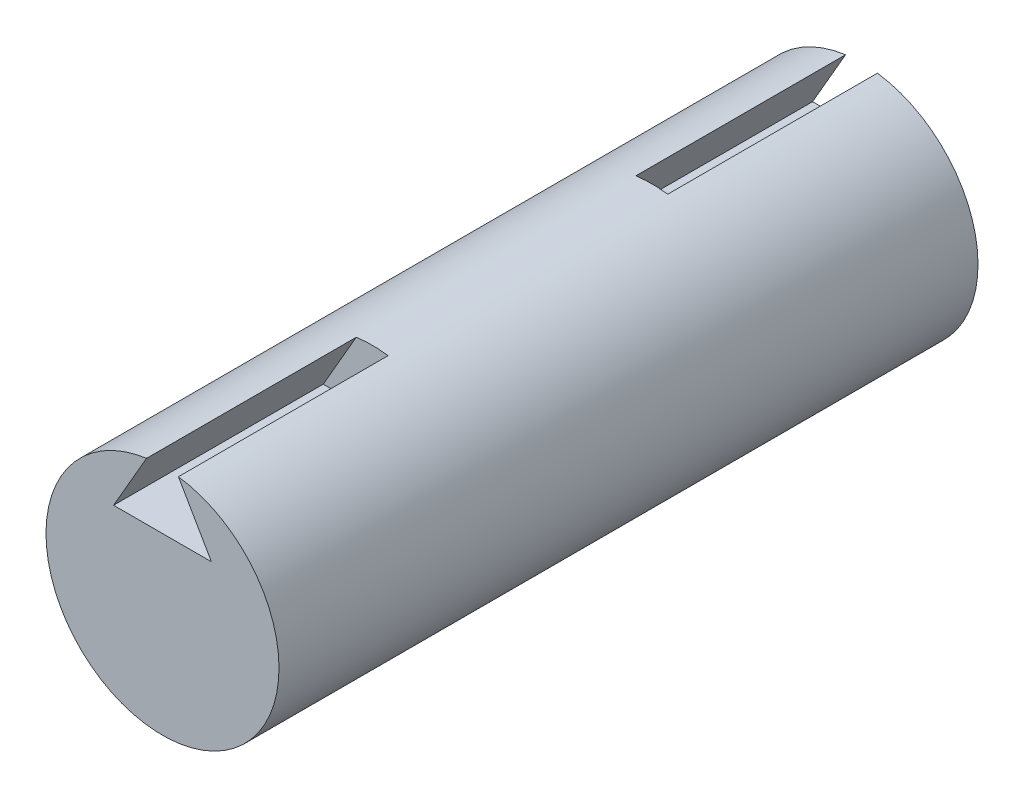
ISO-10303-21;
HEADER;
FILE_DESCRIPTION(('STEP AP214'),'2;1');
FILE_NAME('part.step','',(''),(''),'','','');
FILE_SCHEMA(('AUTOMOTIVE_DESIGN { 1 0 10303 214 1 1 1 1 }'));
ENDSEC;
DATA;
#1=APPLICATION_CONTEXT('core data for automotive mechanical design processes');
#2=APPLICATION_PROTOCOL_DEFINITION('international standard','automotive_design',2000,#1);
#3=PRODUCT_CONTEXT('',#1,'mechanical');
#4=PRODUCT('Part','Part','',(#3));
#5=PRODUCT_RELATED_PRODUCT_CATEGORY('part','',(#4));
#6=PRODUCT_DEFINITION_FORMATION('','',#4);
#7=PRODUCT_DEFINITION_CONTEXT('part definition',#1,'design');
#8=PRODUCT_DEFINITION('design','',#6,#7);
#9=PRODUCT_DEFINITION_SHAPE('','',#8);
#10=(LENGTH_UNIT() NAMED_UNIT(*) SI_UNIT(.MILLI.,.METRE.));
#11=(NAMED_UNIT(*) PLANE_ANGLE_UNIT() SI_UNIT($,.RADIAN.));
#12=(NAMED_UNIT(*) SI_UNIT($,.STERADIAN.) SOLID_ANGLE_UNIT());
#13=UNCERTAINTY_MEASURE_WITH_UNIT(LENGTH_MEASURE(1.E-05),#10,'distance_accuracy_value','');
#14=(GEOMETRIC_REPRESENTATION_CONTEXT(3) GLOBAL_UNCERTAINTY_ASSIGNED_CONTEXT((#13)) GLOBAL_UNIT_ASSIGNED_CONTEXT((#10,
#11,#12)) REPRESENTATION_CONTEXT('',''));
#15=CARTESIAN_POINT('',(0.,0.,0.));
#16=DIRECTION('',(0.,0.,1.));
#17=DIRECTION('',(1.,0.,0.));
#18=AXIS2_PLACEMENT_3D('',#15,#16,#17);
#19=CARTESIAN_POINT('',(0.265753175473055,0.153432667397367,3.));
#20=DIRECTION('',(-0.866025403784438,-0.500000000000001,0.));
#21=DIRECTION('',(0.500000000000001,-0.866025403784438,0.));
#22=AXIS2_PLACEMENT_3D('',#19,#20,#21);
#23=PLANE('',#22);
#24=DIRECTION('',(0.,0.,-1.));
#25=VECTOR('',#24,1.);
#26=CARTESIAN_POINT('',(0.21,0.25,3.));
#27=LINE('',#26,#25);
#28=CARTESIAN_POINT('',(0.21,0.25,0.9));
#29=VERTEX_POINT('',#28);
#30=CARTESIAN_POINT('',(0.21,0.25,0.));
#31=VERTEX_POINT('',#30);
#32=EDGE_CURVE('E122',#29,#31,#27,.T.);
#33=ORIENTED_EDGE('',*,*,#32,.F.);
#34=DIRECTION('',(-0.500000000000001,0.866025403784438,0.));
#35=VECTOR('',#34,1.);
#36=CARTESIAN_POINT('',(0.265753175473055,0.153432667397367,0.9));
#37=LINE('',#36,#35);
#38=CARTESIAN_POINT('',(0.0683743098989274,0.495302890912062,0.9));
#39=VERTEX_POINT('',#38);
#40=EDGE_CURVE('E114',#29,#39,#37,.T.);
#41=ORIENTED_EDGE('',*,*,#40,.T.);
#42=DIRECTION('',(0.,0.,-1.));
#43=VECTOR('',#42,1.);
#44=CARTESIAN_POINT('',(0.0683743098989273,0.495302890912062,3.));
#45=LINE('',#44,#43);
#46=CARTESIAN_POINT('',(0.0683743098989273,0.495302890912062,0.));
#47=VERTEX_POINT('',#46);
#48=EDGE_CURVE('E121',#39,#47,#45,.T.);
#49=ORIENTED_EDGE('',*,*,#48,.T.);
#50=DIRECTION('',(-0.500000000000001,0.866025403784438,0.));
#51=VECTOR('',#50,1.);
#52=CARTESIAN_POINT('',(0.265753175473055,0.153432667397367,0.));
#53=LINE('',#52,#51);
#54=EDGE_CURVE('E152',#31,#47,#53,.T.);
#55=ORIENTED_EDGE('',*,*,#54,.F.);
#56=EDGE_LOOP('',(#33,#41,#49,#55));
#57=FACE_BOUND('',#56,.T.);
#58=ADVANCED_FACE('F37',(#57),#23,.T.);
#59=CARTESIAN_POINT('',(0.,0.25,3.));
#60=DIRECTION('',(0.,1.,0.));
#61=DIRECTION('',(-1.,0.,0.));
#62=AXIS2_PLACEMENT_3D('',#59,#60,#61);
#63=PLANE('',#62);
#64=DIRECTION('',(0.,0.,-1.));
#65=VECTOR('',#64,1.);
#66=CARTESIAN_POINT('',(-0.21,0.25,3.));
#67=LINE('',#66,#65);
#68=CARTESIAN_POINT('',(-0.21,0.25,0.9));
#69=VERTEX_POINT('',#68);
#70=CARTESIAN_POINT('',(-0.21,0.25,0.));
#71=VERTEX_POINT('',#70);
#72=EDGE_CURVE('E138',#69,#71,#67,.T.);
#73=ORIENTED_EDGE('',*,*,#72,.F.);
#74=DIRECTION('',(1.,0.,0.));
#75=VECTOR('',#74,1.);
#76=CARTESIAN_POINT('',(0.,0.25,0.9));
#77=LINE('',#76,#75);
#78=EDGE_CURVE('E52',#69,#29,#77,.T.);
#79=ORIENTED_EDGE('',*,*,#78,.T.);
#80=ORIENTED_EDGE('',*,*,#32,.T.);
#81=DIRECTION('',(1.,0.,0.));
#82=VECTOR('',#81,1.);
#83=CARTESIAN_POINT('',(0.,0.25,0.));
#84=LINE('',#83,#82);
#85=EDGE_CURVE('E143',#71,#31,#84,.T.);
#86=ORIENTED_EDGE('',*,*,#85,.F.);
#87=EDGE_LOOP('',(#73,#79,#80,#86));
#88=FACE_BOUND('',#87,.T.);
#89=ADVANCED_FACE('F141',(#88),#63,.T.);
#90=CARTESIAN_POINT('',(-0.265753175473055,0.153432667397364,3.));
#91=DIRECTION('',(0.866025403784441,-0.499999999999995,0.));
#92=DIRECTION('',(0.499999999999995,0.866025403784442,0.));
#93=AXIS2_PLACEMENT_3D('',#90,#91,#92);
#94=PLANE('',#93);
#95=DIRECTION('',(0.,0.,-1.));
#96=VECTOR('',#95,1.);
#97=CARTESIAN_POINT('',(-0.0683743098989302,0.495302890912061,3.));
#98=LINE('',#97,#96);
#99=CARTESIAN_POINT('',(-0.0683743098989302,0.495302890912061,0.9));
#100=VERTEX_POINT('',#99);
#101=CARTESIAN_POINT('',(-0.0683743098989302,0.495302890912061,0.));
#102=VERTEX_POINT('',#101);
#103=EDGE_CURVE('E84',#100,#102,#98,.T.);
#104=ORIENTED_EDGE('',*,*,#103,.F.);
#105=DIRECTION('',(-0.499999999999995,-0.866025403784442,0.));
#106=VECTOR('',#105,1.);
#107=CARTESIAN_POINT('',(-0.265753175473055,0.153432667397364,0.9));
#108=LINE('',#107,#106);
#109=EDGE_CURVE('E45',#100,#69,#108,.T.);
#110=ORIENTED_EDGE('',*,*,#109,.T.);
#111=ORIENTED_EDGE('',*,*,#72,.T.);
#112=DIRECTION('',(-0.499999999999995,-0.866025403784442,0.));
#113=VECTOR('',#112,1.);
#114=CARTESIAN_POINT('',(-0.265753175473055,0.153432667397364,0.));
#115=LINE('',#114,#113);
#116=EDGE_CURVE('E149',#102,#71,#115,.T.);
#117=ORIENTED_EDGE('',*,*,#116,.F.);
#118=EDGE_LOOP('',(#104,#110,#111,#117));
#119=FACE_BOUND('',#118,.T.);
#120=ADVANCED_FACE('F136',(#119),#94,.T.);
#121=CARTESIAN_POINT('',(0.,0.,3.));
#122=DIRECTION('',(0.,0.,-1.));
#123=DIRECTION('',(-1.,0.,0.));
#124=AXIS2_PLACEMENT_3D('',#121,#122,#123);
#125=CYLINDRICAL_SURFACE('',#124,0.5);
#126=CARTESIAN_POINT('',(-0.0683743098989302,0.495302890912061,3.));
#127=VERTEX_POINT('',#126);
#128=CARTESIAN_POINT('',(-0.0683743098989302,0.495302890912061,2.1));
#129=VERTEX_POINT('',#128);
#130=EDGE_CURVE('E61',#127,#129,#98,.T.);
#131=ORIENTED_EDGE('',*,*,#130,.T.);
#132=CARTESIAN_POINT('',(0.,0.,2.1));
#133=DIRECTION('',(0.,0.,1.));
#134=DIRECTION('',(1.,0.,0.));
#135=AXIS2_PLACEMENT_3D('',#132,#133,#134);
#136=CIRCLE('',#135,0.5);
#137=CARTESIAN_POINT('',(0.0683743098989274,0.495302890912062,2.1));
#138=VERTEX_POINT('',#137);
#139=EDGE_CURVE('E116',#138,#129,#136,.T.);
#140=ORIENTED_EDGE('',*,*,#139,.F.);
#141=CARTESIAN_POINT('',(0.0683743098989273,0.495302890912062,3.));
#142=VERTEX_POINT('',#141);
#143=EDGE_CURVE('E127',#142,#138,#45,.T.);
#144=ORIENTED_EDGE('',*,*,#143,.F.);
#145=CARTESIAN_POINT('',(0.,0.,3.));
#146=DIRECTION('',(0.,0.,1.));
#147=DIRECTION('',(1.,0.,0.));
#148=AXIS2_PLACEMENT_3D('',#145,#146,#147);
#149=CIRCLE('',#148,0.5);
#150=EDGE_CURVE('E91',#127,#142,#149,.T.);
#151=ORIENTED_EDGE('',*,*,#150,.F.);
#152=EDGE_LOOP('',(#131,#140,#144,#151));
#153=FACE_BOUND('',#152,.T.);
#154=ORIENTED_EDGE('',*,*,#48,.F.);
#155=CARTESIAN_POINT('',(0.,0.,0.9));
#156=DIRECTION('',(0.,0.,1.));
#157=DIRECTION('',(1.,0.,0.));
#158=AXIS2_PLACEMENT_3D('',#155,#156,#157);
#159=CIRCLE('',#158,0.5);
#160=EDGE_CURVE('E111',#39,#100,#159,.T.);
#161=ORIENTED_EDGE('',*,*,#160,.T.);
#162=ORIENTED_EDGE('',*,*,#103,.T.);
#163=CARTESIAN_POINT('',(0.,0.,0.));
#164=DIRECTION('',(0.,0.,1.));
#165=DIRECTION('',(1.,0.,0.));
#166=AXIS2_PLACEMENT_3D('',#163,#164,#165);
#167=CIRCLE('',#166,0.5);
#168=EDGE_CURVE('E125',#102,#47,#167,.T.);
#169=ORIENTED_EDGE('',*,*,#168,.T.);
#170=EDGE_LOOP('',(#154,#161,#162,#169));
#171=FACE_BOUND('',#170,.T.);
#172=ADVANCED_FACE('F39',(#153,#171),#125,.T.);
#173=DIRECTION('',(-0.500000000000001,0.866025403784438,0.));
#174=VECTOR('',#173,1.);
#175=CARTESIAN_POINT('',(0.265753175473055,0.153432667397367,2.1));
#176=LINE('',#175,#174);
#177=CARTESIAN_POINT('',(0.21,0.25,2.1));
#178=VERTEX_POINT('',#177);
#179=EDGE_CURVE('E155',#178,#138,#176,.T.);
#180=ORIENTED_EDGE('',*,*,#179,.F.);
#181=CARTESIAN_POINT('',(0.21,0.25,3.));
#182=VERTEX_POINT('',#181);
#183=EDGE_CURVE('E128',#182,#178,#27,.T.);
#184=ORIENTED_EDGE('',*,*,#183,.F.);
#185=DIRECTION('',(-0.500000000000001,0.866025403784438,0.));
#186=VECTOR('',#185,1.);
#187=CARTESIAN_POINT('',(0.265753175473055,0.153432667397367,3.));
#188=LINE('',#187,#186);
#189=EDGE_CURVE('E161',#182,#142,#188,.T.);
#190=ORIENTED_EDGE('',*,*,#189,.T.);
#191=ORIENTED_EDGE('',*,*,#143,.T.);
#192=EDGE_LOOP('',(#180,#184,#190,#191));
#193=FACE_BOUND('',#192,.T.);
#194=ADVANCED_FACE('F180',(#193),#23,.T.);
#195=DIRECTION('',(1.,0.,0.));
#196=VECTOR('',#195,1.);
#197=CARTESIAN_POINT('',(0.,0.25,2.1));
#198=LINE('',#197,#196);
#199=CARTESIAN_POINT('',(-0.21,0.25,2.1));
#200=VERTEX_POINT('',#199);
#201=EDGE_CURVE('E123',#200,#178,#198,.T.);
#202=ORIENTED_EDGE('',*,*,#201,.F.);
#203=CARTESIAN_POINT('',(-0.21,0.25,3.));
#204=VERTEX_POINT('',#203);
#205=EDGE_CURVE('E145',#204,#200,#67,.T.);
#206=ORIENTED_EDGE('',*,*,#205,.F.);
#207=DIRECTION('',(1.,0.,0.));
#208=VECTOR('',#207,1.);
#209=CARTESIAN_POINT('',(0.,0.25,3.));
#210=LINE('',#209,#208);
#211=EDGE_CURVE('E158',#204,#182,#210,.T.);
#212=ORIENTED_EDGE('',*,*,#211,.T.);
#213=ORIENTED_EDGE('',*,*,#183,.T.);
#214=EDGE_LOOP('',(#202,#206,#212,#213));
#215=FACE_BOUND('',#214,.T.);
#216=ADVANCED_FACE('F178',(#215),#63,.T.);
#217=DIRECTION('',(-0.499999999999995,-0.866025403784442,0.));
#218=VECTOR('',#217,1.);
#219=CARTESIAN_POINT('',(-0.265753175473055,0.153432667397364,2.1));
#220=LINE('',#219,#218);
#221=EDGE_CURVE('E11',#129,#200,#220,.T.);
#222=ORIENTED_EDGE('',*,*,#221,.F.);
#223=ORIENTED_EDGE('',*,*,#130,.F.);
#224=DIRECTION('',(-0.499999999999995,-0.866025403784442,0.));
#225=VECTOR('',#224,1.);
#226=CARTESIAN_POINT('',(-0.265753175473055,0.153432667397364,3.));
#227=LINE('',#226,#225);
#228=EDGE_CURVE('E156',#127,#204,#227,.T.);
#229=ORIENTED_EDGE('',*,*,#228,.T.);
#230=ORIENTED_EDGE('',*,*,#205,.T.);
#231=EDGE_LOOP('',(#222,#223,#229,#230));
#232=FACE_BOUND('',#231,.T.);
#233=ADVANCED_FACE('F174',(#232),#94,.T.);
#234=CARTESIAN_POINT('',(0.,0.,3.));
#235=DIRECTION('',(0.,0.,1.));
#236=DIRECTION('',(1.,0.,0.));
#237=AXIS2_PLACEMENT_3D('',#234,#235,#236);
#238=PLANE('',#237);
#239=ORIENTED_EDGE('',*,*,#150,.T.);
#240=ORIENTED_EDGE('',*,*,#189,.F.);
#241=ORIENTED_EDGE('',*,*,#211,.F.);
#242=ORIENTED_EDGE('',*,*,#228,.F.);
#243=EDGE_LOOP('',(#239,#240,#241,#242));
#244=FACE_BOUND('',#243,.T.);
#245=ADVANCED_FACE('F176',(#244),#238,.T.);
#246=CARTESIAN_POINT('',(0.,0.,0.));
#247=DIRECTION('',(0.,0.,1.));
#248=DIRECTION('',(1.,0.,0.));
#249=AXIS2_PLACEMENT_3D('',#246,#247,#248);
#250=PLANE('',#249);
#251=ORIENTED_EDGE('',*,*,#168,.F.);
#252=ORIENTED_EDGE('',*,*,#116,.T.);
#253=ORIENTED_EDGE('',*,*,#85,.T.);
#254=ORIENTED_EDGE('',*,*,#54,.T.);
#255=EDGE_LOOP('',(#251,#252,#253,#254));
#256=FACE_BOUND('',#255,.T.);
#257=ADVANCED_FACE('F197',(#256),#250,.F.);
#258=CARTESIAN_POINT('',(0.,0.,2.1));
#259=DIRECTION('',(0.,0.,1.));
#260=DIRECTION('',(1.,0.,0.));
#261=AXIS2_PLACEMENT_3D('',#258,#259,#260);
#262=PLANE('',#261);
#263=ORIENTED_EDGE('',*,*,#201,.T.);
#264=ORIENTED_EDGE('',*,*,#179,.T.);
#265=ORIENTED_EDGE('',*,*,#139,.T.);
#266=ORIENTED_EDGE('',*,*,#221,.T.);
#267=EDGE_LOOP('',(#263,#264,#265,#266));
#268=FACE_BOUND('',#267,.T.);
#269=ADVANCED_FACE('F170',(#268),#262,.T.);
#270=CARTESIAN_POINT('',(0.,0.,0.9));
#271=DIRECTION('',(0.,0.,1.));
#272=DIRECTION('',(1.,0.,0.));
#273=AXIS2_PLACEMENT_3D('',#270,#271,#272);
#274=PLANE('',#273);
#275=ORIENTED_EDGE('',*,*,#40,.F.);
#276=ORIENTED_EDGE('',*,*,#78,.F.);
#277=ORIENTED_EDGE('',*,*,#109,.F.);
#278=ORIENTED_EDGE('',*,*,#160,.F.);
#279=EDGE_LOOP('',(#275,#276,#277,#278));
#280=FACE_BOUND('',#279,.T.);
#281=ADVANCED_FACE('F113',(#280),#274,.F.);
#282=CLOSED_SHELL('',(#58,#89,#120,#172,#194,#216,#233,#245,#257,#269,#281));
#283=MANIFOLD_SOLID_BREP('B2',#282);
#284=ADVANCED_BREP_SHAPE_REPRESENTATION('',(#18,#283),#14);
#285=SHAPE_DEFINITION_REPRESENTATION(#9,#284);
ENDSEC;
END-ISO-10303-21;
